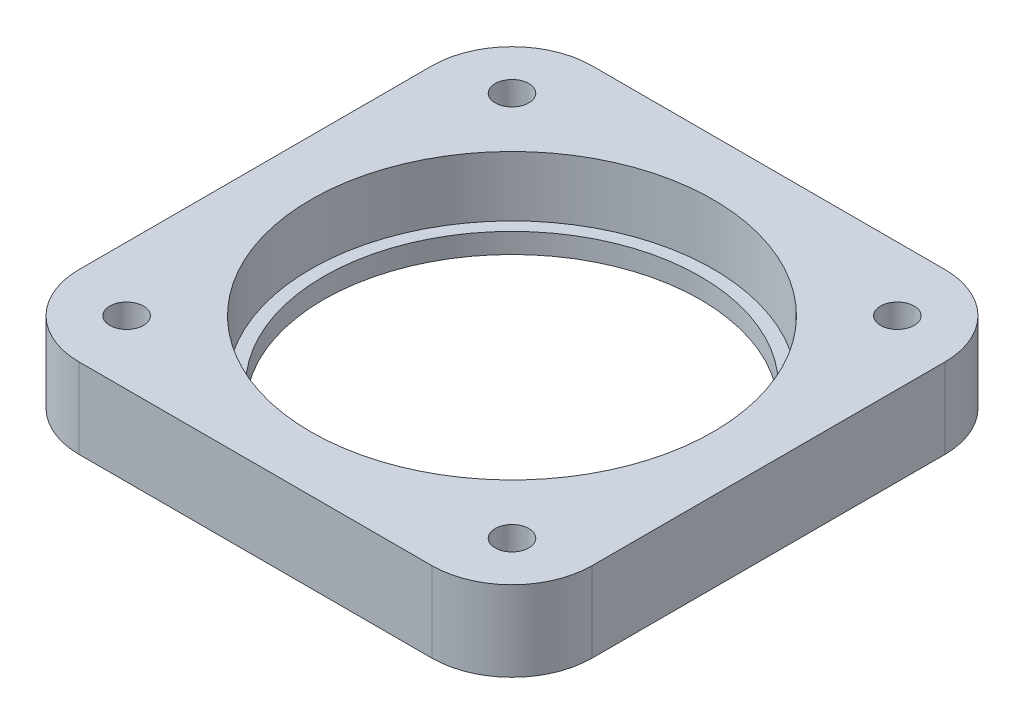
ISO-10303-21;
HEADER;
FILE_DESCRIPTION(('STEP AP214'),'2;1');
FILE_NAME('part.step','',(''),(''),'','','');
FILE_SCHEMA(('AUTOMOTIVE_DESIGN { 1 0 10303 214 1 1 1 1 }'));
ENDSEC;
DATA;
#1=APPLICATION_CONTEXT('core data for automotive mechanical design processes');
#2=APPLICATION_PROTOCOL_DEFINITION('international standard','automotive_design',2000,#1);
#3=PRODUCT_CONTEXT('',#1,'mechanical');
#4=PRODUCT('Part','Part','',(#3));
#5=PRODUCT_RELATED_PRODUCT_CATEGORY('part','',(#4));
#6=PRODUCT_DEFINITION_FORMATION('','',#4);
#7=PRODUCT_DEFINITION_CONTEXT('part definition',#1,'design');
#8=PRODUCT_DEFINITION('design','',#6,#7);
#9=PRODUCT_DEFINITION_SHAPE('','',#8);
#10=(LENGTH_UNIT() NAMED_UNIT(*) SI_UNIT(.MILLI.,.METRE.));
#11=(NAMED_UNIT(*) PLANE_ANGLE_UNIT() SI_UNIT($,.RADIAN.));
#12=(NAMED_UNIT(*) SI_UNIT($,.STERADIAN.) SOLID_ANGLE_UNIT());
#13=UNCERTAINTY_MEASURE_WITH_UNIT(LENGTH_MEASURE(1.E-05),#10,'distance_accuracy_value','');
#14=(GEOMETRIC_REPRESENTATION_CONTEXT(3) GLOBAL_UNCERTAINTY_ASSIGNED_CONTEXT((#13)) GLOBAL_UNIT_ASSIGNED_CONTEXT((#10,
#11,#12)) REPRESENTATION_CONTEXT('',''));
#15=CARTESIAN_POINT('',(0.,0.,0.));
#16=DIRECTION('',(0.,0.,1.));
#17=DIRECTION('',(1.,0.,0.));
#18=AXIS2_PLACEMENT_3D('',#15,#16,#17);
#19=CARTESIAN_POINT('',(0.,2.5,0.));
#20=DIRECTION('',(0.,-1.,0.));
#21=DIRECTION('',(0.,0.,-1.));
#22=AXIS2_PLACEMENT_3D('',#19,#20,#21);
#23=PLANE('',#22);
#24=CARTESIAN_POINT('',(0.,2.5,0.));
#25=DIRECTION('',(0.,1.,0.));
#26=DIRECTION('',(0.,0.,1.));
#27=AXIS2_PLACEMENT_3D('',#24,#25,#26);
#28=CIRCLE('',#27,23.5);
#29=CARTESIAN_POINT('',(0.,2.5,23.5));
#30=VERTEX_POINT('',#29);
#31=EDGE_CURVE('E137',#30,#30,#28,.T.);
#32=ORIENTED_EDGE('',*,*,#31,.F.);
#33=EDGE_LOOP('',(#32));
#34=FACE_BOUND('',#33,.T.);
#35=CARTESIAN_POINT('',(0.,2.5,0.));
#36=DIRECTION('',(0.,1.,0.));
#37=DIRECTION('',(0.,0.,1.));
#38=AXIS2_PLACEMENT_3D('',#35,#36,#37);
#39=CIRCLE('',#38,25.1);
#40=CARTESIAN_POINT('',(0.,2.5,25.1));
#41=VERTEX_POINT('',#40);
#42=EDGE_CURVE('E197',#41,#41,#39,.T.);
#43=ORIENTED_EDGE('',*,*,#42,.T.);
#44=EDGE_LOOP('',(#43));
#45=FACE_BOUND('',#44,.T.);
#46=ADVANCED_FACE('F41',(#34,#45),#23,.F.);
#47=CARTESIAN_POINT('',(0.,0.,0.));
#48=DIRECTION('',(0.,-1.,0.));
#49=DIRECTION('',(0.,0.,-1.));
#50=AXIS2_PLACEMENT_3D('',#47,#48,#49);
#51=PLANE('',#50);
#52=CARTESIAN_POINT('',(-24.0416305603424,0.,-24.0416305603429));
#53=DIRECTION('',(0.,-1.,0.));
#54=DIRECTION('',(0.,0.,-1.));
#55=AXIS2_PLACEMENT_3D('',#52,#53,#54);
#56=CIRCLE('',#55,2.1);
#57=CARTESIAN_POINT('',(-24.0416305603424,0.,-26.1416305603429));
#58=VERTEX_POINT('',#57);
#59=EDGE_CURVE('E200',#58,#58,#56,.T.);
#60=ORIENTED_EDGE('',*,*,#59,.F.);
#61=EDGE_LOOP('',(#60));
#62=FACE_BOUND('',#61,.T.);
#63=CARTESIAN_POINT('',(-24.0416305603428,0.,24.0416305603425));
#64=DIRECTION('',(0.,-1.,0.));
#65=DIRECTION('',(0.,0.,-1.));
#66=AXIS2_PLACEMENT_3D('',#63,#64,#65);
#67=CIRCLE('',#66,2.1);
#68=CARTESIAN_POINT('',(-24.0416305603428,0.,21.9416305603424));
#69=VERTEX_POINT('',#68);
#70=EDGE_CURVE('E205',#69,#69,#67,.T.);
#71=ORIENTED_EDGE('',*,*,#70,.F.);
#72=EDGE_LOOP('',(#71));
#73=FACE_BOUND('',#72,.T.);
#74=CARTESIAN_POINT('',(24.0416305603425,0.,24.0416305603427));
#75=DIRECTION('',(0.,-1.,0.));
#76=DIRECTION('',(0.,0.,-1.));
#77=AXIS2_PLACEMENT_3D('',#74,#75,#76);
#78=CIRCLE('',#77,2.1);
#79=CARTESIAN_POINT('',(24.0416305603425,0.,21.9416305603427));
#80=VERTEX_POINT('',#79);
#81=EDGE_CURVE('E208',#80,#80,#78,.T.);
#82=ORIENTED_EDGE('',*,*,#81,.F.);
#83=EDGE_LOOP('',(#82));
#84=FACE_BOUND('',#83,.T.);
#85=CARTESIAN_POINT('',(24.0416305603426,0.,-24.0416305603426));
#86=DIRECTION('',(0.,-1.,0.));
#87=DIRECTION('',(0.,0.,-1.));
#88=AXIS2_PLACEMENT_3D('',#85,#86,#87);
#89=CIRCLE('',#88,2.1);
#90=CARTESIAN_POINT('',(24.0416305603426,0.,-26.1416305603426));
#91=VERTEX_POINT('',#90);
#92=EDGE_CURVE('E211',#91,#91,#89,.T.);
#93=ORIENTED_EDGE('',*,*,#92,.F.);
#94=EDGE_LOOP('',(#93));
#95=FACE_BOUND('',#94,.T.);
#96=DIRECTION('',(0.,0.,-1.));
#97=VECTOR('',#96,1.);
#98=CARTESIAN_POINT('',(32.,0.,32.));
#99=LINE('',#98,#97);
#100=CARTESIAN_POINT('',(32.,0.,22.));
#101=VERTEX_POINT('',#100);
#102=CARTESIAN_POINT('',(32.,0.,-22.));
#103=VERTEX_POINT('',#102);
#104=EDGE_CURVE('E125',#101,#103,#99,.T.);
#105=ORIENTED_EDGE('',*,*,#104,.F.);
#106=CARTESIAN_POINT('',(22.,0.,22.));
#107=DIRECTION('',(0.,-1.,0.));
#108=DIRECTION('',(0.,0.,-1.));
#109=AXIS2_PLACEMENT_3D('',#106,#107,#108);
#110=CIRCLE('',#109,10.);
#111=CARTESIAN_POINT('',(22.,0.,32.));
#112=VERTEX_POINT('',#111);
#113=EDGE_CURVE('E108',#101,#112,#110,.T.);
#114=ORIENTED_EDGE('',*,*,#113,.T.);
#115=DIRECTION('',(1.,0.,0.));
#116=VECTOR('',#115,1.);
#117=CARTESIAN_POINT('',(-32.,0.,32.));
#118=LINE('',#117,#116);
#119=CARTESIAN_POINT('',(-22.,0.,32.));
#120=VERTEX_POINT('',#119);
#121=EDGE_CURVE('E148',#120,#112,#118,.T.);
#122=ORIENTED_EDGE('',*,*,#121,.F.);
#123=CARTESIAN_POINT('',(-22.,0.,22.));
#124=DIRECTION('',(0.,-1.,0.));
#125=DIRECTION('',(0.,0.,-1.));
#126=AXIS2_PLACEMENT_3D('',#123,#124,#125);
#127=CIRCLE('',#126,10.);
#128=CARTESIAN_POINT('',(-32.,0.,22.));
#129=VERTEX_POINT('',#128);
#130=EDGE_CURVE('E119',#120,#129,#127,.T.);
#131=ORIENTED_EDGE('',*,*,#130,.T.);
#132=DIRECTION('',(0.,0.,1.));
#133=VECTOR('',#132,1.);
#134=CARTESIAN_POINT('',(-32.,0.,32.));
#135=LINE('',#134,#133);
#136=CARTESIAN_POINT('',(-32.,0.,-22.));
#137=VERTEX_POINT('',#136);
#138=EDGE_CURVE('E140',#137,#129,#135,.T.);
#139=ORIENTED_EDGE('',*,*,#138,.F.);
#140=CARTESIAN_POINT('',(-22.,0.,-22.));
#141=DIRECTION('',(0.,-1.,0.));
#142=DIRECTION('',(0.,0.,-1.));
#143=AXIS2_PLACEMENT_3D('',#140,#141,#142);
#144=CIRCLE('',#143,10.);
#145=CARTESIAN_POINT('',(-22.,0.,-32.));
#146=VERTEX_POINT('',#145);
#147=EDGE_CURVE('E129',#137,#146,#144,.T.);
#148=ORIENTED_EDGE('',*,*,#147,.T.);
#149=DIRECTION('',(-1.,0.,0.));
#150=VECTOR('',#149,1.);
#151=CARTESIAN_POINT('',(-32.,0.,-32.));
#152=LINE('',#151,#150);
#153=CARTESIAN_POINT('',(22.,0.,-32.));
#154=VERTEX_POINT('',#153);
#155=EDGE_CURVE('E136',#154,#146,#152,.T.);
#156=ORIENTED_EDGE('',*,*,#155,.F.);
#157=CARTESIAN_POINT('',(22.,0.,-22.));
#158=DIRECTION('',(0.,-1.,0.));
#159=DIRECTION('',(0.,0.,-1.));
#160=AXIS2_PLACEMENT_3D('',#157,#158,#159);
#161=CIRCLE('',#160,10.);
#162=EDGE_CURVE('E135',#154,#103,#161,.T.);
#163=ORIENTED_EDGE('',*,*,#162,.T.);
#164=EDGE_LOOP('',(#105,#114,#122,#131,#139,#148,#156,#163));
#165=FACE_BOUND('',#164,.T.);
#166=CARTESIAN_POINT('',(0.,0.,0.));
#167=DIRECTION('',(0.,1.,0.));
#168=DIRECTION('',(0.,0.,1.));
#169=AXIS2_PLACEMENT_3D('',#166,#167,#168);
#170=CIRCLE('',#169,23.5);
#171=CARTESIAN_POINT('',(0.,0.,23.5));
#172=VERTEX_POINT('',#171);
#173=EDGE_CURVE('E143',#172,#172,#170,.T.);
#174=ORIENTED_EDGE('',*,*,#173,.T.);
#175=EDGE_LOOP('',(#174));
#176=FACE_BOUND('',#175,.T.);
#177=ADVANCED_FACE('F132',(#62,#73,#84,#95,#165,#176),#51,.T.);
#178=CARTESIAN_POINT('',(32.,2.5,32.));
#179=DIRECTION('',(-1.,0.,0.));
#180=DIRECTION('',(0.,0.,1.));
#181=AXIS2_PLACEMENT_3D('',#178,#179,#180);
#182=PLANE('',#181);
#183=DIRECTION('',(0.,0.,-1.));
#184=VECTOR('',#183,1.);
#185=CARTESIAN_POINT('',(32.,10.,32.));
#186=LINE('',#185,#184);
#187=CARTESIAN_POINT('',(32.,10.,22.));
#188=VERTEX_POINT('',#187);
#189=CARTESIAN_POINT('',(32.,10.,-22.));
#190=VERTEX_POINT('',#189);
#191=EDGE_CURVE('E128',#188,#190,#186,.T.);
#192=ORIENTED_EDGE('',*,*,#191,.F.);
#193=DIRECTION('',(0.,-1.,0.));
#194=VECTOR('',#193,1.);
#195=CARTESIAN_POINT('',(32.,2.5,22.));
#196=LINE('',#195,#194);
#197=EDGE_CURVE('E112',#188,#101,#196,.T.);
#198=ORIENTED_EDGE('',*,*,#197,.T.);
#199=ORIENTED_EDGE('',*,*,#104,.T.);
#200=DIRECTION('',(0.,-1.,0.));
#201=VECTOR('',#200,1.);
#202=CARTESIAN_POINT('',(32.,2.5,-22.));
#203=LINE('',#202,#201);
#204=EDGE_CURVE('E130',#103,#190,#203,.F.);
#205=ORIENTED_EDGE('',*,*,#204,.T.);
#206=EDGE_LOOP('',(#192,#198,#199,#205));
#207=FACE_BOUND('',#206,.T.);
#208=ADVANCED_FACE('F124',(#207),#182,.F.);
#209=CARTESIAN_POINT('',(-32.,2.5,-32.));
#210=DIRECTION('',(0.,0.,1.));
#211=DIRECTION('',(1.,0.,0.));
#212=AXIS2_PLACEMENT_3D('',#209,#210,#211);
#213=PLANE('',#212);
#214=DIRECTION('',(-1.,0.,0.));
#215=VECTOR('',#214,1.);
#216=CARTESIAN_POINT('',(-32.,10.,-32.));
#217=LINE('',#216,#215);
#218=CARTESIAN_POINT('',(22.,10.,-32.));
#219=VERTEX_POINT('',#218);
#220=CARTESIAN_POINT('',(-22.,10.,-32.));
#221=VERTEX_POINT('',#220);
#222=EDGE_CURVE('E171',#219,#221,#217,.T.);
#223=ORIENTED_EDGE('',*,*,#222,.F.);
#224=DIRECTION('',(0.,-1.,0.));
#225=VECTOR('',#224,1.);
#226=CARTESIAN_POINT('',(22.,2.5,-32.));
#227=LINE('',#226,#225);
#228=EDGE_CURVE('E11',#219,#154,#227,.T.);
#229=ORIENTED_EDGE('',*,*,#228,.T.);
#230=ORIENTED_EDGE('',*,*,#155,.T.);
#231=DIRECTION('',(0.,-1.,0.));
#232=VECTOR('',#231,1.);
#233=CARTESIAN_POINT('',(-22.,2.5,-32.));
#234=LINE('',#233,#232);
#235=EDGE_CURVE('E49',#146,#221,#234,.F.);
#236=ORIENTED_EDGE('',*,*,#235,.T.);
#237=EDGE_LOOP('',(#223,#229,#230,#236));
#238=FACE_BOUND('',#237,.T.);
#239=ADVANCED_FACE('F170',(#238),#213,.F.);
#240=CARTESIAN_POINT('',(-32.,2.5,32.));
#241=DIRECTION('',(1.,0.,0.));
#242=DIRECTION('',(0.,0.,-1.));
#243=AXIS2_PLACEMENT_3D('',#240,#241,#242);
#244=PLANE('',#243);
#245=ORIENTED_EDGE('',*,*,#138,.T.);
#246=DIRECTION('',(0.,-1.,0.));
#247=VECTOR('',#246,1.);
#248=CARTESIAN_POINT('',(-32.,2.5,22.));
#249=LINE('',#248,#247);
#250=CARTESIAN_POINT('',(-32.,10.,22.));
#251=VERTEX_POINT('',#250);
#252=EDGE_CURVE('E56',#129,#251,#249,.F.);
#253=ORIENTED_EDGE('',*,*,#252,.T.);
#254=DIRECTION('',(0.,0.,1.));
#255=VECTOR('',#254,1.);
#256=CARTESIAN_POINT('',(-32.,10.,32.));
#257=LINE('',#256,#255);
#258=CARTESIAN_POINT('',(-32.,10.,-22.));
#259=VERTEX_POINT('',#258);
#260=EDGE_CURVE('E178',#259,#251,#257,.T.);
#261=ORIENTED_EDGE('',*,*,#260,.F.);
#262=DIRECTION('',(0.,-1.,0.));
#263=VECTOR('',#262,1.);
#264=CARTESIAN_POINT('',(-32.,2.5,-22.));
#265=LINE('',#264,#263);
#266=EDGE_CURVE('E164',#259,#137,#265,.T.);
#267=ORIENTED_EDGE('',*,*,#266,.T.);
#268=EDGE_LOOP('',(#245,#253,#261,#267));
#269=FACE_BOUND('',#268,.T.);
#270=ADVANCED_FACE('F182',(#269),#244,.F.);
#271=CARTESIAN_POINT('',(-32.,2.5,32.));
#272=DIRECTION('',(0.,0.,-1.));
#273=DIRECTION('',(-1.,0.,0.));
#274=AXIS2_PLACEMENT_3D('',#271,#272,#273);
#275=PLANE('',#274);
#276=ORIENTED_EDGE('',*,*,#121,.T.);
#277=DIRECTION('',(0.,-1.,0.));
#278=VECTOR('',#277,1.);
#279=CARTESIAN_POINT('',(22.,2.5,32.));
#280=LINE('',#279,#278);
#281=CARTESIAN_POINT('',(22.,10.,32.));
#282=VERTEX_POINT('',#281);
#283=EDGE_CURVE('E113',#112,#282,#280,.F.);
#284=ORIENTED_EDGE('',*,*,#283,.T.);
#285=DIRECTION('',(1.,0.,0.));
#286=VECTOR('',#285,1.);
#287=CARTESIAN_POINT('',(-32.,10.,32.));
#288=LINE('',#287,#286);
#289=CARTESIAN_POINT('',(-22.,10.,32.));
#290=VERTEX_POINT('',#289);
#291=EDGE_CURVE('E190',#290,#282,#288,.T.);
#292=ORIENTED_EDGE('',*,*,#291,.F.);
#293=DIRECTION('',(0.,-1.,0.));
#294=VECTOR('',#293,1.);
#295=CARTESIAN_POINT('',(-22.,2.5,32.));
#296=LINE('',#295,#294);
#297=EDGE_CURVE('E118',#290,#120,#296,.T.);
#298=ORIENTED_EDGE('',*,*,#297,.T.);
#299=EDGE_LOOP('',(#276,#284,#292,#298));
#300=FACE_BOUND('',#299,.T.);
#301=ADVANCED_FACE('F189',(#300),#275,.F.);
#302=CARTESIAN_POINT('',(0.,2.5,0.));
#303=DIRECTION('',(0.,-1.,0.));
#304=DIRECTION('',(0.,0.,-1.));
#305=AXIS2_PLACEMENT_3D('',#302,#303,#304);
#306=CYLINDRICAL_SURFACE('',#305,23.5);
#307=ORIENTED_EDGE('',*,*,#31,.T.);
#308=EDGE_LOOP('',(#307));
#309=FACE_BOUND('',#308,.T.);
#310=ORIENTED_EDGE('',*,*,#173,.F.);
#311=EDGE_LOOP('',(#310));
#312=FACE_BOUND('',#311,.T.);
#313=ADVANCED_FACE('F232',(#309,#312),#306,.F.);
#314=CARTESIAN_POINT('',(0.,10.,0.));
#315=DIRECTION('',(0.,-1.,0.));
#316=DIRECTION('',(0.,0.,-1.));
#317=AXIS2_PLACEMENT_3D('',#314,#315,#316);
#318=PLANE('',#317);
#319=CARTESIAN_POINT('',(-24.0416305603424,10.,-24.0416305603429));
#320=DIRECTION('',(0.,1.,0.));
#321=DIRECTION('',(0.,0.,1.));
#322=AXIS2_PLACEMENT_3D('',#319,#320,#321);
#323=CIRCLE('',#322,2.1);
#324=CARTESIAN_POINT('',(-24.0416305603424,10.,-21.9416305603429));
#325=VERTEX_POINT('',#324);
#326=EDGE_CURVE('E218',#325,#325,#323,.T.);
#327=ORIENTED_EDGE('',*,*,#326,.F.);
#328=EDGE_LOOP('',(#327));
#329=FACE_BOUND('',#328,.T.);
#330=CARTESIAN_POINT('',(-24.0416305603428,10.,24.0416305603425));
#331=DIRECTION('',(0.,1.,0.));
#332=DIRECTION('',(0.,0.,1.));
#333=AXIS2_PLACEMENT_3D('',#330,#331,#332);
#334=CIRCLE('',#333,2.1);
#335=CARTESIAN_POINT('',(-24.0416305603428,10.,26.1416305603425));
#336=VERTEX_POINT('',#335);
#337=EDGE_CURVE('E221',#336,#336,#334,.T.);
#338=ORIENTED_EDGE('',*,*,#337,.F.);
#339=EDGE_LOOP('',(#338));
#340=FACE_BOUND('',#339,.T.);
#341=CARTESIAN_POINT('',(24.0416305603425,10.,24.0416305603427));
#342=DIRECTION('',(0.,1.,0.));
#343=DIRECTION('',(0.,0.,1.));
#344=AXIS2_PLACEMENT_3D('',#341,#342,#343);
#345=CIRCLE('',#344,2.1);
#346=CARTESIAN_POINT('',(24.0416305603425,10.,26.1416305603427));
#347=VERTEX_POINT('',#346);
#348=EDGE_CURVE('E217',#347,#347,#345,.T.);
#349=ORIENTED_EDGE('',*,*,#348,.F.);
#350=EDGE_LOOP('',(#349));
#351=FACE_BOUND('',#350,.T.);
#352=CARTESIAN_POINT('',(24.0416305603426,10.,-24.0416305603426));
#353=DIRECTION('',(0.,1.,0.));
#354=DIRECTION('',(0.,0.,1.));
#355=AXIS2_PLACEMENT_3D('',#352,#353,#354);
#356=CIRCLE('',#355,2.1);
#357=CARTESIAN_POINT('',(24.0416305603426,10.,-21.9416305603426));
#358=VERTEX_POINT('',#357);
#359=EDGE_CURVE('E214',#358,#358,#356,.T.);
#360=ORIENTED_EDGE('',*,*,#359,.F.);
#361=EDGE_LOOP('',(#360));
#362=FACE_BOUND('',#361,.T.);
#363=ORIENTED_EDGE('',*,*,#291,.T.);
#364=CARTESIAN_POINT('',(22.,10.,22.));
#365=DIRECTION('',(0.,-1.,0.));
#366=DIRECTION('',(0.,0.,-1.));
#367=AXIS2_PLACEMENT_3D('',#364,#365,#366);
#368=CIRCLE('',#367,10.);
#369=EDGE_CURVE('E162',#282,#188,#368,.F.);
#370=ORIENTED_EDGE('',*,*,#369,.T.);
#371=ORIENTED_EDGE('',*,*,#191,.T.);
#372=CARTESIAN_POINT('',(22.,10.,-22.));
#373=DIRECTION('',(0.,-1.,0.));
#374=DIRECTION('',(0.,0.,-1.));
#375=AXIS2_PLACEMENT_3D('',#372,#373,#374);
#376=CIRCLE('',#375,10.);
#377=EDGE_CURVE('E158',#190,#219,#376,.F.);
#378=ORIENTED_EDGE('',*,*,#377,.T.);
#379=ORIENTED_EDGE('',*,*,#222,.T.);
#380=CARTESIAN_POINT('',(-22.,10.,-22.));
#381=DIRECTION('',(0.,-1.,0.));
#382=DIRECTION('',(0.,0.,-1.));
#383=AXIS2_PLACEMENT_3D('',#380,#381,#382);
#384=CIRCLE('',#383,10.);
#385=EDGE_CURVE('E63',#221,#259,#384,.F.);
#386=ORIENTED_EDGE('',*,*,#385,.T.);
#387=ORIENTED_EDGE('',*,*,#260,.T.);
#388=CARTESIAN_POINT('',(-22.,10.,22.));
#389=DIRECTION('',(0.,-1.,0.));
#390=DIRECTION('',(0.,0.,-1.));
#391=AXIS2_PLACEMENT_3D('',#388,#389,#390);
#392=CIRCLE('',#391,10.);
#393=EDGE_CURVE('E160',#251,#290,#392,.F.);
#394=ORIENTED_EDGE('',*,*,#393,.T.);
#395=EDGE_LOOP('',(#363,#370,#371,#378,#379,#386,#387,#394));
#396=FACE_BOUND('',#395,.T.);
#397=CARTESIAN_POINT('',(0.,10.,0.));
#398=DIRECTION('',(0.,1.,0.));
#399=DIRECTION('',(0.,0.,1.));
#400=AXIS2_PLACEMENT_3D('',#397,#398,#399);
#401=CIRCLE('',#400,25.1);
#402=CARTESIAN_POINT('',(0.,10.,25.1));
#403=VERTEX_POINT('',#402);
#404=EDGE_CURVE('E196',#403,#403,#401,.T.);
#405=ORIENTED_EDGE('',*,*,#404,.F.);
#406=EDGE_LOOP('',(#405));
#407=FACE_BOUND('',#406,.T.);
#408=ADVANCED_FACE('F175',(#329,#340,#351,#362,#396,#407),#318,.F.);
#409=CARTESIAN_POINT('',(0.,10.,0.));
#410=DIRECTION('',(0.,-1.,0.));
#411=DIRECTION('',(0.,0.,-1.));
#412=AXIS2_PLACEMENT_3D('',#409,#410,#411);
#413=CYLINDRICAL_SURFACE('',#412,25.1);
#414=ORIENTED_EDGE('',*,*,#404,.T.);
#415=EDGE_LOOP('',(#414));
#416=FACE_BOUND('',#415,.T.);
#417=ORIENTED_EDGE('',*,*,#42,.F.);
#418=EDGE_LOOP('',(#417));
#419=FACE_BOUND('',#418,.T.);
#420=ADVANCED_FACE('F231',(#416,#419),#413,.F.);
#421=CARTESIAN_POINT('',(24.0416305603426,-10.,-24.0416305603426));
#422=DIRECTION('',(0.,1.,0.));
#423=DIRECTION('',(0.,0.,1.));
#424=AXIS2_PLACEMENT_3D('',#421,#422,#423);
#425=CYLINDRICAL_SURFACE('',#424,2.1);
#426=ORIENTED_EDGE('',*,*,#92,.T.);
#427=EDGE_LOOP('',(#426));
#428=FACE_BOUND('',#427,.T.);
#429=ORIENTED_EDGE('',*,*,#359,.T.);
#430=EDGE_LOOP('',(#429));
#431=FACE_BOUND('',#430,.T.);
#432=ADVANCED_FACE('F237',(#428,#431),#425,.F.);
#433=CARTESIAN_POINT('',(24.0416305603425,-10.,24.0416305603427));
#434=DIRECTION('',(0.,1.,0.));
#435=DIRECTION('',(0.,0.,1.));
#436=AXIS2_PLACEMENT_3D('',#433,#434,#435);
#437=CYLINDRICAL_SURFACE('',#436,2.1);
#438=ORIENTED_EDGE('',*,*,#81,.T.);
#439=EDGE_LOOP('',(#438));
#440=FACE_BOUND('',#439,.T.);
#441=ORIENTED_EDGE('',*,*,#348,.T.);
#442=EDGE_LOOP('',(#441));
#443=FACE_BOUND('',#442,.T.);
#444=ADVANCED_FACE('F227',(#440,#443),#437,.F.);
#445=CARTESIAN_POINT('',(-24.0416305603428,-10.,24.0416305603425));
#446=DIRECTION('',(0.,1.,0.));
#447=DIRECTION('',(0.,0.,1.));
#448=AXIS2_PLACEMENT_3D('',#445,#446,#447);
#449=CYLINDRICAL_SURFACE('',#448,2.1);
#450=ORIENTED_EDGE('',*,*,#70,.T.);
#451=EDGE_LOOP('',(#450));
#452=FACE_BOUND('',#451,.T.);
#453=ORIENTED_EDGE('',*,*,#337,.T.);
#454=EDGE_LOOP('',(#453));
#455=FACE_BOUND('',#454,.T.);
#456=ADVANCED_FACE('F245',(#452,#455),#449,.F.);
#457=CARTESIAN_POINT('',(-24.0416305603424,-10.,-24.0416305603429));
#458=DIRECTION('',(0.,1.,0.));
#459=DIRECTION('',(0.,0.,1.));
#460=AXIS2_PLACEMENT_3D('',#457,#458,#459);
#461=CYLINDRICAL_SURFACE('',#460,2.1);
#462=ORIENTED_EDGE('',*,*,#59,.T.);
#463=EDGE_LOOP('',(#462));
#464=FACE_BOUND('',#463,.T.);
#465=ORIENTED_EDGE('',*,*,#326,.T.);
#466=EDGE_LOOP('',(#465));
#467=FACE_BOUND('',#466,.T.);
#468=ADVANCED_FACE('F274',(#464,#467),#461,.F.);
#469=CARTESIAN_POINT('',(22.,2.5,22.));
#470=DIRECTION('',(0.,-1.,0.));
#471=DIRECTION('',(0.,0.,-1.));
#472=AXIS2_PLACEMENT_3D('',#469,#470,#471);
#473=CYLINDRICAL_SURFACE('',#472,10.);
#474=ORIENTED_EDGE('',*,*,#369,.F.);
#475=ORIENTED_EDGE('',*,*,#283,.F.);
#476=ORIENTED_EDGE('',*,*,#113,.F.);
#477=ORIENTED_EDGE('',*,*,#197,.F.);
#478=EDGE_LOOP('',(#474,#475,#476,#477));
#479=FACE_BOUND('',#478,.T.);
#480=ADVANCED_FACE('F111',(#479),#473,.T.);
#481=CARTESIAN_POINT('',(-22.,2.5,22.));
#482=DIRECTION('',(0.,-1.,0.));
#483=DIRECTION('',(0.,0.,-1.));
#484=AXIS2_PLACEMENT_3D('',#481,#482,#483);
#485=CYLINDRICAL_SURFACE('',#484,10.);
#486=ORIENTED_EDGE('',*,*,#393,.F.);
#487=ORIENTED_EDGE('',*,*,#252,.F.);
#488=ORIENTED_EDGE('',*,*,#130,.F.);
#489=ORIENTED_EDGE('',*,*,#297,.F.);
#490=EDGE_LOOP('',(#486,#487,#488,#489));
#491=FACE_BOUND('',#490,.T.);
#492=ADVANCED_FACE('F186',(#491),#485,.T.);
#493=CARTESIAN_POINT('',(22.,2.5,-22.));
#494=DIRECTION('',(0.,-1.,0.));
#495=DIRECTION('',(0.,0.,-1.));
#496=AXIS2_PLACEMENT_3D('',#493,#494,#495);
#497=CYLINDRICAL_SURFACE('',#496,10.);
#498=ORIENTED_EDGE('',*,*,#377,.F.);
#499=ORIENTED_EDGE('',*,*,#204,.F.);
#500=ORIENTED_EDGE('',*,*,#162,.F.);
#501=ORIENTED_EDGE('',*,*,#228,.F.);
#502=EDGE_LOOP('',(#498,#499,#500,#501));
#503=FACE_BOUND('',#502,.T.);
#504=ADVANCED_FACE('F276',(#503),#497,.T.);
#505=CARTESIAN_POINT('',(-22.,2.5,-22.));
#506=DIRECTION('',(0.,-1.,0.));
#507=DIRECTION('',(0.,0.,-1.));
#508=AXIS2_PLACEMENT_3D('',#505,#506,#507);
#509=CYLINDRICAL_SURFACE('',#508,10.);
#510=ORIENTED_EDGE('',*,*,#385,.F.);
#511=ORIENTED_EDGE('',*,*,#235,.F.);
#512=ORIENTED_EDGE('',*,*,#147,.F.);
#513=ORIENTED_EDGE('',*,*,#266,.F.);
#514=EDGE_LOOP('',(#510,#511,#512,#513));
#515=FACE_BOUND('',#514,.T.);
#516=ADVANCED_FACE('F43',(#515),#509,.T.);
#517=CLOSED_SHELL('',(#46,#177,#208,#239,#270,#301,#313,#408,#420,#432,#444,#456,#468,#480,#492,
#504,#516));
#518=MANIFOLD_SOLID_BREP('B2',#517);
#519=ADVANCED_BREP_SHAPE_REPRESENTATION('',(#18,#518),#14);
#520=SHAPE_DEFINITION_REPRESENTATION(#9,#519);
ENDSEC;
END-ISO-10303-21;
